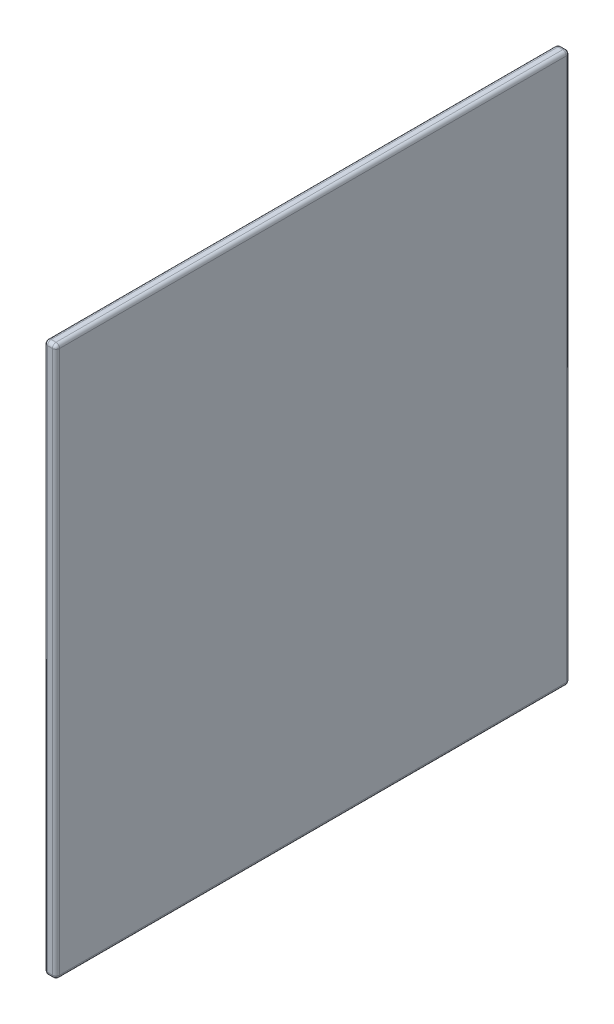
ISO-10303-21;
HEADER;
FILE_DESCRIPTION(('STEP AP214'),'2;1');
FILE_NAME('part.step','',(''),(''),'','','');
FILE_SCHEMA(('AUTOMOTIVE_DESIGN { 1 0 10303 214 1 1 1 1 }'));
ENDSEC;
DATA;
#1=APPLICATION_CONTEXT('core data for automotive mechanical design processes');
#2=APPLICATION_PROTOCOL_DEFINITION('international standard','automotive_design',2000,#1);
#3=PRODUCT_CONTEXT('',#1,'mechanical');
#4=PRODUCT('Part','Part','',(#3));
#5=PRODUCT_RELATED_PRODUCT_CATEGORY('part','',(#4));
#6=PRODUCT_DEFINITION_FORMATION('','',#4);
#7=PRODUCT_DEFINITION_CONTEXT('part definition',#1,'design');
#8=PRODUCT_DEFINITION('design','',#6,#7);
#9=PRODUCT_DEFINITION_SHAPE('','',#8);
#10=(LENGTH_UNIT() NAMED_UNIT(*) SI_UNIT(.MILLI.,.METRE.));
#11=(NAMED_UNIT(*) PLANE_ANGLE_UNIT() SI_UNIT($,.RADIAN.));
#12=(NAMED_UNIT(*) SI_UNIT($,.STERADIAN.) SOLID_ANGLE_UNIT());
#13=UNCERTAINTY_MEASURE_WITH_UNIT(LENGTH_MEASURE(1.E-05),#10,'distance_accuracy_value','');
#14=(GEOMETRIC_REPRESENTATION_CONTEXT(3) GLOBAL_UNCERTAINTY_ASSIGNED_CONTEXT((#13)) GLOBAL_UNIT_ASSIGNED_CONTEXT((#10,
#11,#12)) REPRESENTATION_CONTEXT('',''));
#15=CARTESIAN_POINT('',(0.,0.,0.));
#16=DIRECTION('',(0.,0.,1.));
#17=DIRECTION('',(1.,0.,0.));
#18=AXIS2_PLACEMENT_3D('',#15,#16,#17);
#19=CARTESIAN_POINT('',(31.7,22.7,15.2));
#20=DIRECTION('',(0.,-1.,0.));
#21=DIRECTION('',(1.,0.,0.));
#22=AXIS2_PLACEMENT_3D('',#19,#20,#21);
#23=SPHERICAL_SURFACE('',#22,0.3);
#24=CARTESIAN_POINT('',(31.7,22.7,15.2));
#25=DIRECTION('',(0.,0.,-1.));
#26=DIRECTION('',(1.,0.,0.));
#27=AXIS2_PLACEMENT_3D('',#24,#25,#26);
#28=CIRCLE('',#27,0.3);
#29=CARTESIAN_POINT('',(31.7,23.,15.2));
#30=VERTEX_POINT('',#29);
#31=CARTESIAN_POINT('',(32.,22.7,15.2));
#32=VERTEX_POINT('',#31);
#33=EDGE_CURVE('E10',#30,#32,#28,.T.);
#34=ORIENTED_EDGE('',*,*,#33,.F.);
#35=CARTESIAN_POINT('',(31.7,22.7,15.2));
#36=DIRECTION('',(1.,0.,0.));
#37=DIRECTION('',(0.,0.,1.));
#38=AXIS2_PLACEMENT_3D('',#35,#36,#37);
#39=CIRCLE('',#38,0.3);
#40=CARTESIAN_POINT('',(31.7,22.7,15.5));
#41=VERTEX_POINT('',#40);
#42=EDGE_CURVE('E240',#30,#41,#39,.T.);
#43=ORIENTED_EDGE('',*,*,#42,.T.);
#44=CARTESIAN_POINT('',(31.7,22.7,15.2));
#45=DIRECTION('',(0.,-1.,0.));
#46=DIRECTION('',(1.,0.,0.));
#47=AXIS2_PLACEMENT_3D('',#44,#45,#46);
#48=CIRCLE('',#47,0.3);
#49=EDGE_CURVE('E248',#32,#41,#48,.T.);
#50=ORIENTED_EDGE('',*,*,#49,.F.);
#51=EDGE_LOOP('',(#34,#43,#50));
#52=FACE_BOUND('',#51,.T.);
#53=ADVANCED_FACE('F16',(#52),#23,.T.);
#54=CARTESIAN_POINT('',(31.7,22.7,-27.2));
#55=DIRECTION('',(0.,0.,1.));
#56=DIRECTION('',(1.,0.,0.));
#57=AXIS2_PLACEMENT_3D('',#54,#55,#56);
#58=SPHERICAL_SURFACE('',#57,0.3);
#59=CARTESIAN_POINT('',(31.7,22.7,-27.2));
#60=DIRECTION('',(0.,-1.,0.));
#61=DIRECTION('',(1.,0.,0.));
#62=AXIS2_PLACEMENT_3D('',#59,#60,#61);
#63=CIRCLE('',#62,0.3);
#64=CARTESIAN_POINT('',(31.7,22.7,-27.5));
#65=VERTEX_POINT('',#64);
#66=CARTESIAN_POINT('',(32.,22.7,-27.2));
#67=VERTEX_POINT('',#66);
#68=EDGE_CURVE('E223',#65,#67,#63,.T.);
#69=ORIENTED_EDGE('',*,*,#68,.F.);
#70=CARTESIAN_POINT('',(31.7,22.7,-27.2));
#71=DIRECTION('',(1.,0.,0.));
#72=DIRECTION('',(0.,1.,0.));
#73=AXIS2_PLACEMENT_3D('',#70,#71,#72);
#74=CIRCLE('',#73,0.3);
#75=CARTESIAN_POINT('',(31.7,23.,-27.2));
#76=VERTEX_POINT('',#75);
#77=EDGE_CURVE('E235',#65,#76,#74,.T.);
#78=ORIENTED_EDGE('',*,*,#77,.T.);
#79=CARTESIAN_POINT('',(31.7,22.7,-27.2));
#80=DIRECTION('',(0.,0.,1.));
#81=DIRECTION('',(1.,0.,0.));
#82=AXIS2_PLACEMENT_3D('',#79,#80,#81);
#83=CIRCLE('',#82,0.3);
#84=EDGE_CURVE('E19',#67,#76,#83,.T.);
#85=ORIENTED_EDGE('',*,*,#84,.F.);
#86=EDGE_LOOP('',(#69,#78,#85));
#87=FACE_BOUND('',#86,.T.);
#88=ADVANCED_FACE('F387',(#87),#58,.T.);
#89=CARTESIAN_POINT('',(32.,-23.,-27.5));
#90=DIRECTION('',(1.,0.,0.));
#91=DIRECTION('',(0.,1.,0.));
#92=AXIS2_PLACEMENT_3D('',#89,#90,#91);
#93=PLANE('',#92);
#94=DIRECTION('',(0.,0.,1.));
#95=VECTOR('',#94,1.);
#96=CARTESIAN_POINT('',(32.,-22.7,-27.5));
#97=LINE('',#96,#95);
#98=CARTESIAN_POINT('',(32.,-22.7,-27.2));
#99=VERTEX_POINT('',#98);
#100=CARTESIAN_POINT('',(32.,-22.7,15.2));
#101=VERTEX_POINT('',#100);
#102=EDGE_CURVE('E145',#99,#101,#97,.T.);
#103=ORIENTED_EDGE('',*,*,#102,.F.);
#104=DIRECTION('',(0.,1.,0.));
#105=VECTOR('',#104,1.);
#106=CARTESIAN_POINT('',(32.,-23.,-27.2));
#107=LINE('',#106,#105);
#108=EDGE_CURVE('E227',#99,#67,#107,.T.);
#109=ORIENTED_EDGE('',*,*,#108,.T.);
#110=DIRECTION('',(0.,0.,1.));
#111=VECTOR('',#110,1.);
#112=CARTESIAN_POINT('',(32.,22.7,-27.5));
#113=LINE('',#112,#111);
#114=EDGE_CURVE('E251',#67,#32,#113,.T.);
#115=ORIENTED_EDGE('',*,*,#114,.T.);
#116=DIRECTION('',(0.,1.,0.));
#117=VECTOR('',#116,1.);
#118=CARTESIAN_POINT('',(32.,-23.,15.2));
#119=LINE('',#118,#117);
#120=EDGE_CURVE('E244',#101,#32,#119,.T.);
#121=ORIENTED_EDGE('',*,*,#120,.F.);
#122=EDGE_LOOP('',(#103,#109,#115,#121));
#123=FACE_BOUND('',#122,.T.);
#124=ADVANCED_FACE('F392',(#123),#93,.T.);
#125=CARTESIAN_POINT('',(31.7,-22.7,15.2));
#126=DIRECTION('',(0.,0.,-1.));
#127=DIRECTION('',(1.,0.,0.));
#128=AXIS2_PLACEMENT_3D('',#125,#126,#127);
#129=SPHERICAL_SURFACE('',#128,0.3);
#130=CARTESIAN_POINT('',(31.7,-22.7,15.2));
#131=DIRECTION('',(0.,1.,0.));
#132=DIRECTION('',(1.,0.,0.));
#133=AXIS2_PLACEMENT_3D('',#130,#131,#132);
#134=CIRCLE('',#133,0.3);
#135=CARTESIAN_POINT('',(31.7,-22.7,15.5));
#136=VERTEX_POINT('',#135);
#137=EDGE_CURVE('E250',#136,#101,#134,.T.);
#138=ORIENTED_EDGE('',*,*,#137,.F.);
#139=CARTESIAN_POINT('',(31.7,-22.7,15.2));
#140=DIRECTION('',(1.,0.,0.));
#141=DIRECTION('',(0.,-1.,0.));
#142=AXIS2_PLACEMENT_3D('',#139,#140,#141);
#143=CIRCLE('',#142,0.3);
#144=CARTESIAN_POINT('',(31.7,-23.,15.2));
#145=VERTEX_POINT('',#144);
#146=EDGE_CURVE('E157',#136,#145,#143,.T.);
#147=ORIENTED_EDGE('',*,*,#146,.T.);
#148=CARTESIAN_POINT('',(31.7,-22.7,15.2));
#149=DIRECTION('',(0.,0.,-1.));
#150=DIRECTION('',(1.,0.,0.));
#151=AXIS2_PLACEMENT_3D('',#148,#149,#150);
#152=CIRCLE('',#151,0.3);
#153=EDGE_CURVE('E146',#101,#145,#152,.T.);
#154=ORIENTED_EDGE('',*,*,#153,.F.);
#155=EDGE_LOOP('',(#138,#147,#154));
#156=FACE_BOUND('',#155,.T.);
#157=ADVANCED_FACE('F399',(#156),#129,.T.);
#158=CARTESIAN_POINT('',(31.7,-22.7,-27.2));
#159=DIRECTION('',(0.,0.,1.));
#160=DIRECTION('',(1.,0.,0.));
#161=AXIS2_PLACEMENT_3D('',#158,#159,#160);
#162=SPHERICAL_SURFACE('',#161,0.3);
#163=CARTESIAN_POINT('',(31.7,-22.7,-27.2));
#164=DIRECTION('',(0.,0.,-1.));
#165=DIRECTION('',(1.,0.,0.));
#166=AXIS2_PLACEMENT_3D('',#163,#164,#165);
#167=CIRCLE('',#166,0.3);
#168=CARTESIAN_POINT('',(31.7,-23.,-27.2));
#169=VERTEX_POINT('',#168);
#170=EDGE_CURVE('E134',#99,#169,#167,.T.);
#171=ORIENTED_EDGE('',*,*,#170,.T.);
#172=CARTESIAN_POINT('',(31.7,-22.7,-27.2));
#173=DIRECTION('',(-1.,0.,0.));
#174=DIRECTION('',(0.,-1.,0.));
#175=AXIS2_PLACEMENT_3D('',#172,#173,#174);
#176=CIRCLE('',#175,0.3);
#177=CARTESIAN_POINT('',(31.7,-22.7,-27.5));
#178=VERTEX_POINT('',#177);
#179=EDGE_CURVE('E137',#178,#169,#176,.T.);
#180=ORIENTED_EDGE('',*,*,#179,.F.);
#181=CARTESIAN_POINT('',(31.7,-22.7,-27.2));
#182=DIRECTION('',(0.,-1.,0.));
#183=DIRECTION('',(1.,0.,0.));
#184=AXIS2_PLACEMENT_3D('',#181,#182,#183);
#185=CIRCLE('',#184,0.3);
#186=EDGE_CURVE('E139',#178,#99,#185,.T.);
#187=ORIENTED_EDGE('',*,*,#186,.T.);
#188=EDGE_LOOP('',(#171,#180,#187));
#189=FACE_BOUND('',#188,.T.);
#190=ADVANCED_FACE('F136',(#189),#162,.T.);
#191=CARTESIAN_POINT('',(31.7,22.7,-27.5));
#192=DIRECTION('',(0.,0.,1.));
#193=DIRECTION('',(1.,0.,0.));
#194=AXIS2_PLACEMENT_3D('',#191,#192,#193);
#195=CYLINDRICAL_SURFACE('',#194,0.3);
#196=ORIENTED_EDGE('',*,*,#114,.F.);
#197=ORIENTED_EDGE('',*,*,#84,.T.);
#198=DIRECTION('',(0.,0.,1.));
#199=VECTOR('',#198,1.);
#200=CARTESIAN_POINT('',(31.7,23.,-27.5));
#201=LINE('',#200,#199);
#202=EDGE_CURVE('E220',#76,#30,#201,.T.);
#203=ORIENTED_EDGE('',*,*,#202,.T.);
#204=ORIENTED_EDGE('',*,*,#33,.T.);
#205=EDGE_LOOP('',(#196,#197,#203,#204));
#206=FACE_BOUND('',#205,.T.);
#207=ADVANCED_FACE('F395',(#206),#195,.T.);
#208=CARTESIAN_POINT('',(31.7,-23.,15.2));
#209=DIRECTION('',(0.,1.,0.));
#210=DIRECTION('',(1.,0.,0.));
#211=AXIS2_PLACEMENT_3D('',#208,#209,#210);
#212=CYLINDRICAL_SURFACE('',#211,0.3);
#213=ORIENTED_EDGE('',*,*,#120,.T.);
#214=ORIENTED_EDGE('',*,*,#49,.T.);
#215=DIRECTION('',(0.,1.,0.));
#216=VECTOR('',#215,1.);
#217=CARTESIAN_POINT('',(31.7,-23.,15.5));
#218=LINE('',#217,#216);
#219=EDGE_CURVE('E205',#136,#41,#218,.T.);
#220=ORIENTED_EDGE('',*,*,#219,.F.);
#221=ORIENTED_EDGE('',*,*,#137,.T.);
#222=EDGE_LOOP('',(#213,#214,#220,#221));
#223=FACE_BOUND('',#222,.T.);
#224=ADVANCED_FACE('F415',(#223),#212,.T.);
#225=CARTESIAN_POINT('',(31.,22.7,15.2));
#226=DIRECTION('',(1.,0.,0.));
#227=DIRECTION('',(0.,1.,0.));
#228=AXIS2_PLACEMENT_3D('',#225,#226,#227);
#229=CYLINDRICAL_SURFACE('',#228,0.3);
#230=CARTESIAN_POINT('',(31.3,22.7,15.2));
#231=DIRECTION('',(1.,0.,0.));
#232=DIRECTION('',(0.,0.,1.));
#233=AXIS2_PLACEMENT_3D('',#230,#231,#232);
#234=CIRCLE('',#233,0.3);
#235=CARTESIAN_POINT('',(31.3,23.,15.2));
#236=VERTEX_POINT('',#235);
#237=CARTESIAN_POINT('',(31.3,22.7,15.5));
#238=VERTEX_POINT('',#237);
#239=EDGE_CURVE('E213',#236,#238,#234,.T.);
#240=ORIENTED_EDGE('',*,*,#239,.T.);
#241=DIRECTION('',(1.,0.,0.));
#242=VECTOR('',#241,1.);
#243=CARTESIAN_POINT('',(31.,22.7,15.5));
#244=LINE('',#243,#242);
#245=EDGE_CURVE('E209',#238,#41,#244,.T.);
#246=ORIENTED_EDGE('',*,*,#245,.T.);
#247=ORIENTED_EDGE('',*,*,#42,.F.);
#248=DIRECTION('',(1.,0.,0.));
#249=VECTOR('',#248,1.);
#250=CARTESIAN_POINT('',(31.,23.,15.2));
#251=LINE('',#250,#249);
#252=EDGE_CURVE('E216',#236,#30,#251,.T.);
#253=ORIENTED_EDGE('',*,*,#252,.F.);
#254=EDGE_LOOP('',(#240,#246,#247,#253));
#255=FACE_BOUND('',#254,.T.);
#256=ADVANCED_FACE('F394',(#255),#229,.T.);
#257=CARTESIAN_POINT('',(31.7,-23.,-27.2));
#258=DIRECTION('',(0.,1.,0.));
#259=DIRECTION('',(1.,0.,0.));
#260=AXIS2_PLACEMENT_3D('',#257,#258,#259);
#261=CYLINDRICAL_SURFACE('',#260,0.3);
#262=ORIENTED_EDGE('',*,*,#186,.F.);
#263=DIRECTION('',(0.,1.,0.));
#264=VECTOR('',#263,1.);
#265=CARTESIAN_POINT('',(31.7,-23.,-27.5));
#266=LINE('',#265,#264);
#267=EDGE_CURVE('E196',#178,#65,#266,.T.);
#268=ORIENTED_EDGE('',*,*,#267,.T.);
#269=ORIENTED_EDGE('',*,*,#68,.T.);
#270=ORIENTED_EDGE('',*,*,#108,.F.);
#271=EDGE_LOOP('',(#262,#268,#269,#270));
#272=FACE_BOUND('',#271,.T.);
#273=ADVANCED_FACE('F397',(#272),#261,.T.);
#274=CARTESIAN_POINT('',(31.,22.7,-27.2));
#275=DIRECTION('',(1.,0.,0.));
#276=DIRECTION('',(0.,1.,0.));
#277=AXIS2_PLACEMENT_3D('',#274,#275,#276);
#278=CYLINDRICAL_SURFACE('',#277,0.3);
#279=DIRECTION('',(1.,0.,0.));
#280=VECTOR('',#279,1.);
#281=CARTESIAN_POINT('',(31.,23.,-27.2));
#282=LINE('',#281,#280);
#283=CARTESIAN_POINT('',(31.3,23.,-27.2));
#284=VERTEX_POINT('',#283);
#285=EDGE_CURVE('E158',#284,#76,#282,.T.);
#286=ORIENTED_EDGE('',*,*,#285,.T.);
#287=ORIENTED_EDGE('',*,*,#77,.F.);
#288=DIRECTION('',(1.,0.,0.));
#289=VECTOR('',#288,1.);
#290=CARTESIAN_POINT('',(31.,22.7,-27.5));
#291=LINE('',#290,#289);
#292=CARTESIAN_POINT('',(31.3,22.7,-27.5));
#293=VERTEX_POINT('',#292);
#294=EDGE_CURVE('E187',#293,#65,#291,.T.);
#295=ORIENTED_EDGE('',*,*,#294,.F.);
#296=CARTESIAN_POINT('',(31.3,22.7,-27.2));
#297=DIRECTION('',(1.,0.,0.));
#298=DIRECTION('',(0.,1.,0.));
#299=AXIS2_PLACEMENT_3D('',#296,#297,#298);
#300=CIRCLE('',#299,0.3);
#301=EDGE_CURVE('E188',#293,#284,#300,.T.);
#302=ORIENTED_EDGE('',*,*,#301,.T.);
#303=EDGE_LOOP('',(#286,#287,#295,#302));
#304=FACE_BOUND('',#303,.T.);
#305=ADVANCED_FACE('F370',(#304),#278,.T.);
#306=CARTESIAN_POINT('',(31.7,-22.7,-27.5));
#307=DIRECTION('',(0.,0.,1.));
#308=DIRECTION('',(1.,0.,0.));
#309=AXIS2_PLACEMENT_3D('',#306,#307,#308);
#310=CYLINDRICAL_SURFACE('',#309,0.3);
#311=ORIENTED_EDGE('',*,*,#153,.T.);
#312=DIRECTION('',(0.,0.,1.));
#313=VECTOR('',#312,1.);
#314=CARTESIAN_POINT('',(31.7,-23.,-27.5));
#315=LINE('',#314,#313);
#316=EDGE_CURVE('E161',#169,#145,#315,.T.);
#317=ORIENTED_EDGE('',*,*,#316,.F.);
#318=ORIENTED_EDGE('',*,*,#170,.F.);
#319=ORIENTED_EDGE('',*,*,#102,.T.);
#320=EDGE_LOOP('',(#311,#317,#318,#319));
#321=FACE_BOUND('',#320,.T.);
#322=ADVANCED_FACE('F162',(#321),#310,.T.);
#323=CARTESIAN_POINT('',(31.,-22.7,15.2));
#324=DIRECTION('',(1.,0.,0.));
#325=DIRECTION('',(0.,-1.,0.));
#326=AXIS2_PLACEMENT_3D('',#323,#324,#325);
#327=CYLINDRICAL_SURFACE('',#326,0.3);
#328=DIRECTION('',(1.,0.,0.));
#329=VECTOR('',#328,1.);
#330=CARTESIAN_POINT('',(31.,-23.,15.2));
#331=LINE('',#330,#329);
#332=CARTESIAN_POINT('',(31.3,-23.,15.2));
#333=VERTEX_POINT('',#332);
#334=EDGE_CURVE('E167',#333,#145,#331,.T.);
#335=ORIENTED_EDGE('',*,*,#334,.T.);
#336=ORIENTED_EDGE('',*,*,#146,.F.);
#337=DIRECTION('',(1.,0.,0.));
#338=VECTOR('',#337,1.);
#339=CARTESIAN_POINT('',(31.,-22.7,15.5));
#340=LINE('',#339,#338);
#341=CARTESIAN_POINT('',(31.3,-22.7,15.5));
#342=VERTEX_POINT('',#341);
#343=EDGE_CURVE('E192',#342,#136,#340,.T.);
#344=ORIENTED_EDGE('',*,*,#343,.F.);
#345=CARTESIAN_POINT('',(31.3,-22.7,15.2));
#346=DIRECTION('',(1.,0.,0.));
#347=DIRECTION('',(0.,-1.,0.));
#348=AXIS2_PLACEMENT_3D('',#345,#346,#347);
#349=CIRCLE('',#348,0.3);
#350=EDGE_CURVE('E175',#342,#333,#349,.T.);
#351=ORIENTED_EDGE('',*,*,#350,.T.);
#352=EDGE_LOOP('',(#335,#336,#344,#351));
#353=FACE_BOUND('',#352,.T.);
#354=ADVANCED_FACE('F402',(#353),#327,.T.);
#355=CARTESIAN_POINT('',(31.,-22.7,-27.2));
#356=DIRECTION('',(1.,0.,0.));
#357=DIRECTION('',(0.,-1.,0.));
#358=AXIS2_PLACEMENT_3D('',#355,#356,#357);
#359=CYLINDRICAL_SURFACE('',#358,0.3);
#360=CARTESIAN_POINT('',(31.3,-22.7,-27.2));
#361=DIRECTION('',(-1.,0.,0.));
#362=DIRECTION('',(0.,-1.,0.));
#363=AXIS2_PLACEMENT_3D('',#360,#361,#362);
#364=CIRCLE('',#363,0.3);
#365=CARTESIAN_POINT('',(31.3,-22.7,-27.5));
#366=VERTEX_POINT('',#365);
#367=CARTESIAN_POINT('',(31.3,-23.,-27.2));
#368=VERTEX_POINT('',#367);
#369=EDGE_CURVE('E180',#366,#368,#364,.T.);
#370=ORIENTED_EDGE('',*,*,#369,.F.);
#371=DIRECTION('',(1.,0.,0.));
#372=VECTOR('',#371,1.);
#373=CARTESIAN_POINT('',(31.,-22.7,-27.5));
#374=LINE('',#373,#372);
#375=EDGE_CURVE('E154',#366,#178,#374,.T.);
#376=ORIENTED_EDGE('',*,*,#375,.T.);
#377=ORIENTED_EDGE('',*,*,#179,.T.);
#378=DIRECTION('',(1.,0.,0.));
#379=VECTOR('',#378,1.);
#380=CARTESIAN_POINT('',(31.,-23.,-27.2));
#381=LINE('',#380,#379);
#382=EDGE_CURVE('E152',#368,#169,#381,.T.);
#383=ORIENTED_EDGE('',*,*,#382,.F.);
#384=EDGE_LOOP('',(#370,#376,#377,#383));
#385=FACE_BOUND('',#384,.T.);
#386=ADVANCED_FACE('F150',(#385),#359,.T.);
#387=CARTESIAN_POINT('',(31.,23.,-27.5));
#388=DIRECTION('',(0.,1.,0.));
#389=DIRECTION('',(1.,0.,0.));
#390=AXIS2_PLACEMENT_3D('',#387,#388,#389);
#391=PLANE('',#390);
#392=DIRECTION('',(0.,0.,1.));
#393=VECTOR('',#392,1.);
#394=CARTESIAN_POINT('',(31.3,23.,-27.5));
#395=LINE('',#394,#393);
#396=EDGE_CURVE('E270',#284,#236,#395,.T.);
#397=ORIENTED_EDGE('',*,*,#396,.T.);
#398=ORIENTED_EDGE('',*,*,#252,.T.);
#399=ORIENTED_EDGE('',*,*,#202,.F.);
#400=ORIENTED_EDGE('',*,*,#285,.F.);
#401=EDGE_LOOP('',(#397,#398,#399,#400));
#402=FACE_BOUND('',#401,.T.);
#403=ADVANCED_FACE('F365',(#402),#391,.T.);
#404=CARTESIAN_POINT('',(31.3,22.7,15.2));
#405=DIRECTION('',(0.,-1.,0.));
#406=DIRECTION('',(-1.,0.,0.));
#407=AXIS2_PLACEMENT_3D('',#404,#405,#406);
#408=SPHERICAL_SURFACE('',#407,0.3);
#409=CARTESIAN_POINT('',(31.3,22.7,15.2));
#410=DIRECTION('',(0.,1.,0.));
#411=DIRECTION('',(-1.,0.,0.));
#412=AXIS2_PLACEMENT_3D('',#409,#410,#411);
#413=CIRCLE('',#412,0.3);
#414=CARTESIAN_POINT('',(31.,22.7,15.2));
#415=VERTEX_POINT('',#414);
#416=EDGE_CURVE('E268',#415,#238,#413,.T.);
#417=ORIENTED_EDGE('',*,*,#416,.T.);
#418=ORIENTED_EDGE('',*,*,#239,.F.);
#419=CARTESIAN_POINT('',(31.3,22.7,15.2));
#420=DIRECTION('',(0.,0.,1.));
#421=DIRECTION('',(-1.,0.,0.));
#422=AXIS2_PLACEMENT_3D('',#419,#420,#421);
#423=CIRCLE('',#422,0.3);
#424=EDGE_CURVE('E274',#236,#415,#423,.T.);
#425=ORIENTED_EDGE('',*,*,#424,.T.);
#426=EDGE_LOOP('',(#417,#418,#425));
#427=FACE_BOUND('',#426,.T.);
#428=ADVANCED_FACE('F361',(#427),#408,.T.);
#429=CARTESIAN_POINT('',(31.,-23.,15.5));
#430=DIRECTION('',(0.,0.,1.));
#431=DIRECTION('',(1.,0.,0.));
#432=AXIS2_PLACEMENT_3D('',#429,#430,#431);
#433=PLANE('',#432);
#434=DIRECTION('',(0.,1.,0.));
#435=VECTOR('',#434,1.);
#436=CARTESIAN_POINT('',(31.3,-23.,15.5));
#437=LINE('',#436,#435);
#438=EDGE_CURVE('E306',#342,#238,#437,.T.);
#439=ORIENTED_EDGE('',*,*,#438,.F.);
#440=ORIENTED_EDGE('',*,*,#343,.T.);
#441=ORIENTED_EDGE('',*,*,#219,.T.);
#442=ORIENTED_EDGE('',*,*,#245,.F.);
#443=EDGE_LOOP('',(#439,#440,#441,#442));
#444=FACE_BOUND('',#443,.T.);
#445=ADVANCED_FACE('F375',(#444),#433,.T.);
#446=CARTESIAN_POINT('',(31.3,22.7,-27.2));
#447=DIRECTION('',(0.,0.,1.));
#448=DIRECTION('',(-1.,0.,0.));
#449=AXIS2_PLACEMENT_3D('',#446,#447,#448);
#450=SPHERICAL_SURFACE('',#449,0.3);
#451=CARTESIAN_POINT('',(31.3,22.7,-27.2));
#452=DIRECTION('',(0.,0.,-1.));
#453=DIRECTION('',(-1.,0.,0.));
#454=AXIS2_PLACEMENT_3D('',#451,#452,#453);
#455=CIRCLE('',#454,0.3);
#456=CARTESIAN_POINT('',(31.,22.7,-27.2));
#457=VERTEX_POINT('',#456);
#458=EDGE_CURVE('E273',#457,#284,#455,.T.);
#459=ORIENTED_EDGE('',*,*,#458,.T.);
#460=ORIENTED_EDGE('',*,*,#301,.F.);
#461=CARTESIAN_POINT('',(31.3,22.7,-27.2));
#462=DIRECTION('',(0.,1.,0.));
#463=DIRECTION('',(-1.,0.,0.));
#464=AXIS2_PLACEMENT_3D('',#461,#462,#463);
#465=CIRCLE('',#464,0.3);
#466=EDGE_CURVE('E297',#293,#457,#465,.T.);
#467=ORIENTED_EDGE('',*,*,#466,.T.);
#468=EDGE_LOOP('',(#459,#460,#467));
#469=FACE_BOUND('',#468,.T.);
#470=ADVANCED_FACE('F372',(#469),#450,.T.);
#471=CARTESIAN_POINT('',(31.,-23.,-27.5));
#472=DIRECTION('',(0.,0.,1.));
#473=DIRECTION('',(1.,0.,0.));
#474=AXIS2_PLACEMENT_3D('',#471,#472,#473);
#475=PLANE('',#474);
#476=ORIENTED_EDGE('',*,*,#294,.T.);
#477=ORIENTED_EDGE('',*,*,#267,.F.);
#478=ORIENTED_EDGE('',*,*,#375,.F.);
#479=DIRECTION('',(0.,1.,0.));
#480=VECTOR('',#479,1.);
#481=CARTESIAN_POINT('',(31.3,-23.,-27.5));
#482=LINE('',#481,#480);
#483=EDGE_CURVE('E291',#366,#293,#482,.T.);
#484=ORIENTED_EDGE('',*,*,#483,.T.);
#485=EDGE_LOOP('',(#476,#477,#478,#484));
#486=FACE_BOUND('',#485,.T.);
#487=ADVANCED_FACE('F374',(#486),#475,.F.);
#488=CARTESIAN_POINT('',(31.,-23.,-27.5));
#489=DIRECTION('',(0.,1.,0.));
#490=DIRECTION('',(1.,0.,0.));
#491=AXIS2_PLACEMENT_3D('',#488,#489,#490);
#492=PLANE('',#491);
#493=ORIENTED_EDGE('',*,*,#382,.T.);
#494=ORIENTED_EDGE('',*,*,#316,.T.);
#495=ORIENTED_EDGE('',*,*,#334,.F.);
#496=DIRECTION('',(0.,0.,1.));
#497=VECTOR('',#496,1.);
#498=CARTESIAN_POINT('',(31.3,-23.,-27.5));
#499=LINE('',#498,#497);
#500=EDGE_CURVE('E172',#368,#333,#499,.T.);
#501=ORIENTED_EDGE('',*,*,#500,.F.);
#502=EDGE_LOOP('',(#493,#494,#495,#501));
#503=FACE_BOUND('',#502,.T.);
#504=ADVANCED_FACE('F170',(#503),#492,.F.);
#505=CARTESIAN_POINT('',(31.3,-22.7,15.2));
#506=DIRECTION('',(0.,0.,-1.));
#507=DIRECTION('',(-1.,0.,0.));
#508=AXIS2_PLACEMENT_3D('',#505,#506,#507);
#509=SPHERICAL_SURFACE('',#508,0.3);
#510=CARTESIAN_POINT('',(31.3,-22.7,15.2));
#511=DIRECTION('',(0.,0.,1.));
#512=DIRECTION('',(-1.,0.,0.));
#513=AXIS2_PLACEMENT_3D('',#510,#511,#512);
#514=CIRCLE('',#513,0.3);
#515=CARTESIAN_POINT('',(31.,-22.7,15.2));
#516=VERTEX_POINT('',#515);
#517=EDGE_CURVE('E304',#516,#333,#514,.T.);
#518=ORIENTED_EDGE('',*,*,#517,.T.);
#519=ORIENTED_EDGE('',*,*,#350,.F.);
#520=CARTESIAN_POINT('',(31.3,-22.7,15.2));
#521=DIRECTION('',(0.,-1.,0.));
#522=DIRECTION('',(-1.,0.,0.));
#523=AXIS2_PLACEMENT_3D('',#520,#521,#522);
#524=CIRCLE('',#523,0.3);
#525=EDGE_CURVE('E290',#342,#516,#524,.T.);
#526=ORIENTED_EDGE('',*,*,#525,.T.);
#527=EDGE_LOOP('',(#518,#519,#526));
#528=FACE_BOUND('',#527,.T.);
#529=ADVANCED_FACE('F403',(#528),#509,.T.);
#530=CARTESIAN_POINT('',(31.3,-22.7,-27.2));
#531=DIRECTION('',(0.,0.,1.));
#532=DIRECTION('',(-1.,0.,0.));
#533=AXIS2_PLACEMENT_3D('',#530,#531,#532);
#534=SPHERICAL_SURFACE('',#533,0.3);
#535=CARTESIAN_POINT('',(31.3,-22.7,-27.2));
#536=DIRECTION('',(0.,1.,0.));
#537=DIRECTION('',(-1.,0.,0.));
#538=AXIS2_PLACEMENT_3D('',#535,#536,#537);
#539=CIRCLE('',#538,0.3);
#540=CARTESIAN_POINT('',(31.,-22.7,-27.2));
#541=VERTEX_POINT('',#540);
#542=EDGE_CURVE('E285',#366,#541,#539,.T.);
#543=ORIENTED_EDGE('',*,*,#542,.F.);
#544=ORIENTED_EDGE('',*,*,#369,.T.);
#545=CARTESIAN_POINT('',(31.3,-22.7,-27.2));
#546=DIRECTION('',(0.,0.,1.));
#547=DIRECTION('',(-1.,0.,0.));
#548=AXIS2_PLACEMENT_3D('',#545,#546,#547);
#549=CIRCLE('',#548,0.3);
#550=EDGE_CURVE('E283',#541,#368,#549,.T.);
#551=ORIENTED_EDGE('',*,*,#550,.F.);
#552=EDGE_LOOP('',(#543,#544,#551));
#553=FACE_BOUND('',#552,.T.);
#554=ADVANCED_FACE('F282',(#553),#534,.T.);
#555=CARTESIAN_POINT('',(31.3,22.7,-27.5));
#556=DIRECTION('',(0.,0.,1.));
#557=DIRECTION('',(-1.,0.,0.));
#558=AXIS2_PLACEMENT_3D('',#555,#556,#557);
#559=CYLINDRICAL_SURFACE('',#558,0.3);
#560=ORIENTED_EDGE('',*,*,#424,.F.);
#561=ORIENTED_EDGE('',*,*,#396,.F.);
#562=ORIENTED_EDGE('',*,*,#458,.F.);
#563=DIRECTION('',(0.,0.,1.));
#564=VECTOR('',#563,1.);
#565=CARTESIAN_POINT('',(31.,22.7,-27.5));
#566=LINE('',#565,#564);
#567=EDGE_CURVE('E341',#457,#415,#566,.T.);
#568=ORIENTED_EDGE('',*,*,#567,.T.);
#569=EDGE_LOOP('',(#560,#561,#562,#568));
#570=FACE_BOUND('',#569,.T.);
#571=ADVANCED_FACE('F352',(#570),#559,.T.);
#572=CARTESIAN_POINT('',(31.3,-23.,15.2));
#573=DIRECTION('',(0.,1.,0.));
#574=DIRECTION('',(-1.,0.,0.));
#575=AXIS2_PLACEMENT_3D('',#572,#573,#574);
#576=CYLINDRICAL_SURFACE('',#575,0.3);
#577=ORIENTED_EDGE('',*,*,#525,.F.);
#578=ORIENTED_EDGE('',*,*,#438,.T.);
#579=ORIENTED_EDGE('',*,*,#416,.F.);
#580=DIRECTION('',(0.,1.,0.));
#581=VECTOR('',#580,1.);
#582=CARTESIAN_POINT('',(31.,-23.,15.2));
#583=LINE('',#582,#581);
#584=EDGE_CURVE('E342',#516,#415,#583,.T.);
#585=ORIENTED_EDGE('',*,*,#584,.F.);
#586=EDGE_LOOP('',(#577,#578,#579,#585));
#587=FACE_BOUND('',#586,.T.);
#588=ADVANCED_FACE('F358',(#587),#576,.T.);
#589=CARTESIAN_POINT('',(31.3,-23.,-27.2));
#590=DIRECTION('',(0.,1.,0.));
#591=DIRECTION('',(-1.,0.,0.));
#592=AXIS2_PLACEMENT_3D('',#589,#590,#591);
#593=CYLINDRICAL_SURFACE('',#592,0.3);
#594=DIRECTION('',(0.,1.,0.));
#595=VECTOR('',#594,1.);
#596=CARTESIAN_POINT('',(31.,-23.,-27.2));
#597=LINE('',#596,#595);
#598=EDGE_CURVE('E337',#541,#457,#597,.T.);
#599=ORIENTED_EDGE('',*,*,#598,.T.);
#600=ORIENTED_EDGE('',*,*,#466,.F.);
#601=ORIENTED_EDGE('',*,*,#483,.F.);
#602=ORIENTED_EDGE('',*,*,#542,.T.);
#603=EDGE_LOOP('',(#599,#600,#601,#602));
#604=FACE_BOUND('',#603,.T.);
#605=ADVANCED_FACE('F295',(#604),#593,.T.);
#606=CARTESIAN_POINT('',(31.3,-22.7,-27.5));
#607=DIRECTION('',(0.,0.,1.));
#608=DIRECTION('',(-1.,0.,0.));
#609=AXIS2_PLACEMENT_3D('',#606,#607,#608);
#610=CYLINDRICAL_SURFACE('',#609,0.3);
#611=DIRECTION('',(0.,0.,1.));
#612=VECTOR('',#611,1.);
#613=CARTESIAN_POINT('',(31.,-22.7,-27.5));
#614=LINE('',#613,#612);
#615=EDGE_CURVE('E334',#541,#516,#614,.T.);
#616=ORIENTED_EDGE('',*,*,#615,.F.);
#617=ORIENTED_EDGE('',*,*,#550,.T.);
#618=ORIENTED_EDGE('',*,*,#500,.T.);
#619=ORIENTED_EDGE('',*,*,#517,.F.);
#620=EDGE_LOOP('',(#616,#617,#618,#619));
#621=FACE_BOUND('',#620,.T.);
#622=ADVANCED_FACE('F405',(#621),#610,.T.);
#623=CARTESIAN_POINT('',(31.,-23.,-27.5));
#624=DIRECTION('',(1.,0.,0.));
#625=DIRECTION('',(0.,1.,0.));
#626=AXIS2_PLACEMENT_3D('',#623,#624,#625);
#627=PLANE('',#626);
#628=ORIENTED_EDGE('',*,*,#584,.T.);
#629=ORIENTED_EDGE('',*,*,#567,.F.);
#630=ORIENTED_EDGE('',*,*,#598,.F.);
#631=ORIENTED_EDGE('',*,*,#615,.T.);
#632=EDGE_LOOP('',(#628,#629,#630,#631));
#633=FACE_BOUND('',#632,.T.);
#634=ADVANCED_FACE('F357',(#633),#627,.F.);
#635=CLOSED_SHELL('',(#53,#88,#124,#157,#190,#207,#224,#256,#273,#305,#322,#354,#386,#403,#428,
#445,#470,#487,#504,#529,#554,#571,#588,#605,#622,#634));
#636=MANIFOLD_SOLID_BREP('B1',#635);
#637=ADVANCED_BREP_SHAPE_REPRESENTATION('',(#18,#636),#14);
#638=SHAPE_DEFINITION_REPRESENTATION(#9,#637);
ENDSEC;
END-ISO-10303-21;
